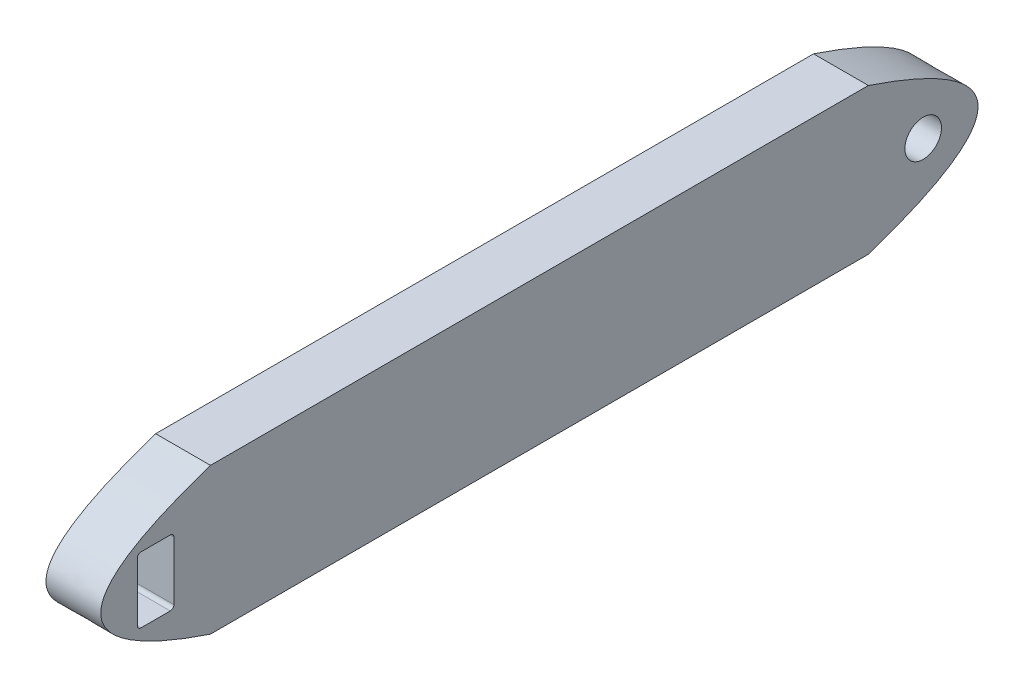
ISO-10303-21;
HEADER;
FILE_DESCRIPTION(('STEP AP214'),'2;1');
FILE_NAME('part.step','',(''),(''),'','','');
FILE_SCHEMA(('AUTOMOTIVE_DESIGN { 1 0 10303 214 1 1 1 1 }'));
ENDSEC;
DATA;
#1=APPLICATION_CONTEXT('core data for automotive mechanical design processes');
#2=APPLICATION_PROTOCOL_DEFINITION('international standard','automotive_design',2000,#1);
#3=PRODUCT_CONTEXT('',#1,'mechanical');
#4=PRODUCT('Part','Part','',(#3));
#5=PRODUCT_RELATED_PRODUCT_CATEGORY('part','',(#4));
#6=PRODUCT_DEFINITION_FORMATION('','',#4);
#7=PRODUCT_DEFINITION_CONTEXT('part definition',#1,'design');
#8=PRODUCT_DEFINITION('design','',#6,#7);
#9=PRODUCT_DEFINITION_SHAPE('','',#8);
#10=(LENGTH_UNIT() NAMED_UNIT(*) SI_UNIT(.MILLI.,.METRE.));
#11=(NAMED_UNIT(*) PLANE_ANGLE_UNIT() SI_UNIT($,.RADIAN.));
#12=(NAMED_UNIT(*) SI_UNIT($,.STERADIAN.) SOLID_ANGLE_UNIT());
#13=UNCERTAINTY_MEASURE_WITH_UNIT(LENGTH_MEASURE(1.E-05),#10,'distance_accuracy_value','');
#14=(GEOMETRIC_REPRESENTATION_CONTEXT(3) GLOBAL_UNCERTAINTY_ASSIGNED_CONTEXT((#13)) GLOBAL_UNIT_ASSIGNED_CONTEXT((#10,
#11,#12)) REPRESENTATION_CONTEXT('',''));
#15=CARTESIAN_POINT('',(0.,0.,0.));
#16=DIRECTION('',(0.,0.,1.));
#17=DIRECTION('',(1.,0.,0.));
#18=AXIS2_PLACEMENT_3D('',#15,#16,#17);
#19=CARTESIAN_POINT('',(15.,1.9853372072383,72.1526989816066));
#20=DIRECTION('',(-1.,0.,0.));
#21=DIRECTION('',(0.,0.,1.));
#22=AXIS2_PLACEMENT_3D('',#19,#20,#21);
#23=PLANE('',#22);
#24=CARTESIAN_POINT('',(15.,21.9853372072383,42.1526989816066));
#25=CARTESIAN_POINT('',(15.,1.9853372072383,102.152698981607));
#26=CARTESIAN_POINT('',(15.,-18.0146627927617,42.1526989816066));
#27=B_SPLINE_CURVE_WITH_KNOTS('',2,(#24,#25,#26),.UNSPECIFIED.,.F.,.F.,(3,3),(0.,1.),.UNSPECIFIED.);
#28=CARTESIAN_POINT('',(15.,21.9853372072383,42.1526989816066));
#29=VERTEX_POINT('',#28);
#30=CARTESIAN_POINT('',(15.,-18.0146627927617,42.1526989816066));
#31=VERTEX_POINT('',#30);
#32=EDGE_CURVE('E245',#29,#31,#27,.T.);
#33=ORIENTED_EDGE('',*,*,#32,.T.);
#34=DIRECTION('',(0.,0.,-1.));
#35=VECTOR('',#34,1.);
#36=CARTESIAN_POINT('',(15.,-18.0146627927617,42.1526989816066));
#37=LINE('',#36,#35);
#38=CARTESIAN_POINT('',(15.,-18.0146627927617,-137.847301018393));
#39=VERTEX_POINT('',#38);
#40=EDGE_CURVE('E95',#31,#39,#37,.T.);
#41=ORIENTED_EDGE('',*,*,#40,.T.);
#42=CARTESIAN_POINT('',(15.,-18.0146627927617,-137.847301018393));
#43=CARTESIAN_POINT('',(15.,1.98533720723832,-197.847301018393));
#44=CARTESIAN_POINT('',(15.,21.9853372072383,-137.847301018393));
#45=B_SPLINE_CURVE_WITH_KNOTS('',2,(#42,#43,#44),.UNSPECIFIED.,.F.,.F.,(3,3),(0.,1.),.UNSPECIFIED.);
#46=CARTESIAN_POINT('',(15.,21.9853372072383,-137.847301018393));
#47=VERTEX_POINT('',#46);
#48=EDGE_CURVE('E256',#39,#47,#45,.T.);
#49=ORIENTED_EDGE('',*,*,#48,.T.);
#50=DIRECTION('',(0.,0.,1.));
#51=VECTOR('',#50,1.);
#52=CARTESIAN_POINT('',(15.,21.9853372072383,42.1526989816066));
#53=LINE('',#52,#51);
#54=EDGE_CURVE('E67',#47,#29,#53,.T.);
#55=ORIENTED_EDGE('',*,*,#54,.T.);
#56=EDGE_LOOP('',(#33,#41,#49,#55));
#57=FACE_BOUND('',#56,.T.);
#58=DIRECTION('',(0.,-1.,0.));
#59=VECTOR('',#58,1.);
#60=CARTESIAN_POINT('',(15.,9.98533720723832,62.1526989816066));
#61=LINE('',#60,#59);
#62=CARTESIAN_POINT('',(15.,9.98533720723832,62.1526989816066));
#63=VERTEX_POINT('',#62);
#64=CARTESIAN_POINT('',(15.,-6.0146627927617,62.1526989816066));
#65=VERTEX_POINT('',#64);
#66=EDGE_CURVE('E194',#63,#65,#61,.T.);
#67=ORIENTED_EDGE('',*,*,#66,.F.);
#68=CARTESIAN_POINT('',(15.,9.9853372072383,61.1526989816066));
#69=DIRECTION('',(1.,0.,0.));
#70=DIRECTION('',(0.,0.,1.));
#71=AXIS2_PLACEMENT_3D('',#68,#69,#70);
#72=CIRCLE('',#71,1.);
#73=CARTESIAN_POINT('',(15.,10.9853372072383,61.1526989816066));
#74=VERTEX_POINT('',#73);
#75=EDGE_CURVE('E58',#74,#63,#72,.T.);
#76=ORIENTED_EDGE('',*,*,#75,.F.);
#77=DIRECTION('',(0.,0.,1.));
#78=VECTOR('',#77,1.);
#79=CARTESIAN_POINT('',(15.,10.9853372072383,53.1526989816066));
#80=LINE('',#79,#78);
#81=CARTESIAN_POINT('',(15.,10.9853372072383,53.1526989816066));
#82=VERTEX_POINT('',#81);
#83=EDGE_CURVE('E166',#82,#74,#80,.T.);
#84=ORIENTED_EDGE('',*,*,#83,.F.);
#85=CARTESIAN_POINT('',(15.,9.9853372072383,53.1526989816066));
#86=DIRECTION('',(1.,0.,0.));
#87=DIRECTION('',(0.,0.,-1.));
#88=AXIS2_PLACEMENT_3D('',#85,#86,#87);
#89=CIRCLE('',#88,1.);
#90=CARTESIAN_POINT('',(15.,9.98533720723832,52.1526989816066));
#91=VERTEX_POINT('',#90);
#92=EDGE_CURVE('E170',#91,#82,#89,.T.);
#93=ORIENTED_EDGE('',*,*,#92,.F.);
#94=DIRECTION('',(0.,1.,0.));
#95=VECTOR('',#94,1.);
#96=CARTESIAN_POINT('',(15.,9.98533720723832,52.1526989816066));
#97=LINE('',#96,#95);
#98=CARTESIAN_POINT('',(15.,-6.0146627927617,52.1526989816066));
#99=VERTEX_POINT('',#98);
#100=EDGE_CURVE('E209',#99,#91,#97,.T.);
#101=ORIENTED_EDGE('',*,*,#100,.F.);
#102=CARTESIAN_POINT('',(15.,-6.01466279276169,53.1526989816066));
#103=DIRECTION('',(1.,0.,0.));
#104=DIRECTION('',(0.,0.,1.));
#105=AXIS2_PLACEMENT_3D('',#102,#103,#104);
#106=CIRCLE('',#105,1.);
#107=CARTESIAN_POINT('',(15.,-7.01466279276169,53.1526989816066));
#108=VERTEX_POINT('',#107);
#109=EDGE_CURVE('E205',#108,#99,#106,.T.);
#110=ORIENTED_EDGE('',*,*,#109,.F.);
#111=DIRECTION('',(0.,0.,-1.));
#112=VECTOR('',#111,1.);
#113=CARTESIAN_POINT('',(15.,-7.01466279276169,53.1526989816066));
#114=LINE('',#113,#112);
#115=CARTESIAN_POINT('',(15.,-7.01466279276169,61.1526989816066));
#116=VERTEX_POINT('',#115);
#117=EDGE_CURVE('E201',#116,#108,#114,.T.);
#118=ORIENTED_EDGE('',*,*,#117,.F.);
#119=CARTESIAN_POINT('',(15.,-6.01466279276169,61.1526989816066));
#120=DIRECTION('',(1.,0.,0.));
#121=DIRECTION('',(0.,0.,-1.));
#122=AXIS2_PLACEMENT_3D('',#119,#120,#121);
#123=CIRCLE('',#122,0.999999999999999);
#124=EDGE_CURVE('E197',#65,#116,#123,.T.);
#125=ORIENTED_EDGE('',*,*,#124,.F.);
#126=EDGE_LOOP('',(#67,#76,#84,#93,#101,#110,#118,#125));
#127=FACE_BOUND('',#126,.T.);
#128=CARTESIAN_POINT('',(15.,1.9853372072383,-152.847301018393));
#129=DIRECTION('',(1.,0.,0.));
#130=DIRECTION('',(0.,0.,-1.));
#131=AXIS2_PLACEMENT_3D('',#128,#129,#130);
#132=CIRCLE('',#131,4.99999999999999);
#133=CARTESIAN_POINT('',(15.,1.9853372072383,-157.847301018393));
#134=VERTEX_POINT('',#133);
#135=EDGE_CURVE('E238',#134,#134,#132,.T.);
#136=ORIENTED_EDGE('',*,*,#135,.F.);
#137=EDGE_LOOP('',(#136));
#138=FACE_BOUND('',#137,.T.);
#139=ADVANCED_FACE('F41',(#57,#127,#138),#23,.F.);
#140=CARTESIAN_POINT('',(0.,1.9853372072383,72.1526989816066));
#141=DIRECTION('',(-1.,0.,0.));
#142=DIRECTION('',(0.,0.,1.));
#143=AXIS2_PLACEMENT_3D('',#140,#141,#142);
#144=PLANE('',#143);
#145=CARTESIAN_POINT('',(0.,9.9853372072383,61.1526989816066));
#146=DIRECTION('',(1.,0.,0.));
#147=DIRECTION('',(0.,0.,1.));
#148=AXIS2_PLACEMENT_3D('',#145,#146,#147);
#149=CIRCLE('',#148,1.);
#150=CARTESIAN_POINT('',(0.,10.9853372072383,61.1526989816066));
#151=VERTEX_POINT('',#150);
#152=CARTESIAN_POINT('',(0.,9.98533720723832,62.1526989816066));
#153=VERTEX_POINT('',#152);
#154=EDGE_CURVE('E153',#151,#153,#149,.T.);
#155=ORIENTED_EDGE('',*,*,#154,.T.);
#156=DIRECTION('',(0.,-1.,0.));
#157=VECTOR('',#156,1.);
#158=CARTESIAN_POINT('',(0.,9.98533720723832,62.1526989816066));
#159=LINE('',#158,#157);
#160=CARTESIAN_POINT('',(0.,-6.0146627927617,62.1526989816066));
#161=VERTEX_POINT('',#160);
#162=EDGE_CURVE('E141',#153,#161,#159,.T.);
#163=ORIENTED_EDGE('',*,*,#162,.T.);
#164=CARTESIAN_POINT('',(0.,-6.01466279276169,61.1526989816066));
#165=DIRECTION('',(1.,0.,0.));
#166=DIRECTION('',(0.,0.,-1.));
#167=AXIS2_PLACEMENT_3D('',#164,#165,#166);
#168=CIRCLE('',#167,0.999999999999999);
#169=CARTESIAN_POINT('',(0.,-7.01466279276169,61.1526989816066));
#170=VERTEX_POINT('',#169);
#171=EDGE_CURVE('E152',#161,#170,#168,.T.);
#172=ORIENTED_EDGE('',*,*,#171,.T.);
#173=DIRECTION('',(0.,0.,-1.));
#174=VECTOR('',#173,1.);
#175=CARTESIAN_POINT('',(0.,-7.01466279276169,53.1526989816066));
#176=LINE('',#175,#174);
#177=CARTESIAN_POINT('',(0.,-7.01466279276169,53.1526989816066));
#178=VERTEX_POINT('',#177);
#179=EDGE_CURVE('E175',#170,#178,#176,.T.);
#180=ORIENTED_EDGE('',*,*,#179,.T.);
#181=CARTESIAN_POINT('',(0.,-6.01466279276169,53.1526989816066));
#182=DIRECTION('',(1.,0.,0.));
#183=DIRECTION('',(0.,0.,1.));
#184=AXIS2_PLACEMENT_3D('',#181,#182,#183);
#185=CIRCLE('',#184,1.);
#186=CARTESIAN_POINT('',(0.,-6.0146627927617,52.1526989816066));
#187=VERTEX_POINT('',#186);
#188=EDGE_CURVE('E179',#178,#187,#185,.T.);
#189=ORIENTED_EDGE('',*,*,#188,.T.);
#190=DIRECTION('',(0.,1.,0.));
#191=VECTOR('',#190,1.);
#192=CARTESIAN_POINT('',(0.,9.98533720723832,52.1526989816066));
#193=LINE('',#192,#191);
#194=CARTESIAN_POINT('',(0.,9.98533720723832,52.1526989816066));
#195=VERTEX_POINT('',#194);
#196=EDGE_CURVE('E183',#187,#195,#193,.T.);
#197=ORIENTED_EDGE('',*,*,#196,.T.);
#198=CARTESIAN_POINT('',(0.,9.9853372072383,53.1526989816066));
#199=DIRECTION('',(1.,0.,0.));
#200=DIRECTION('',(0.,0.,-1.));
#201=AXIS2_PLACEMENT_3D('',#198,#199,#200);
#202=CIRCLE('',#201,1.);
#203=CARTESIAN_POINT('',(0.,10.9853372072383,53.1526989816066));
#204=VERTEX_POINT('',#203);
#205=EDGE_CURVE('E187',#195,#204,#202,.T.);
#206=ORIENTED_EDGE('',*,*,#205,.T.);
#207=DIRECTION('',(0.,0.,1.));
#208=VECTOR('',#207,1.);
#209=CARTESIAN_POINT('',(0.,10.9853372072383,53.1526989816066));
#210=LINE('',#209,#208);
#211=EDGE_CURVE('E159',#204,#151,#210,.T.);
#212=ORIENTED_EDGE('',*,*,#211,.T.);
#213=EDGE_LOOP('',(#155,#163,#172,#180,#189,#197,#206,#212));
#214=FACE_BOUND('',#213,.T.);
#215=CARTESIAN_POINT('',(0.,21.9853372072383,42.1526989816066));
#216=CARTESIAN_POINT('',(0.,1.9853372072383,102.152698981607));
#217=CARTESIAN_POINT('',(0.,-18.0146627927617,42.1526989816066));
#218=B_SPLINE_CURVE_WITH_KNOTS('',2,(#215,#216,#217),.UNSPECIFIED.,.F.,.F.,(3,3),(0.,1.),.UNSPECIFIED.);
#219=CARTESIAN_POINT('',(0.,21.9853372072383,42.1526989816066));
#220=VERTEX_POINT('',#219);
#221=CARTESIAN_POINT('',(0.,-18.0146627927617,42.1526989816066));
#222=VERTEX_POINT('',#221);
#223=EDGE_CURVE('E242',#220,#222,#218,.T.);
#224=ORIENTED_EDGE('',*,*,#223,.F.);
#225=DIRECTION('',(0.,0.,1.));
#226=VECTOR('',#225,1.);
#227=CARTESIAN_POINT('',(0.,21.9853372072383,42.1526989816066));
#228=LINE('',#227,#226);
#229=CARTESIAN_POINT('',(0.,21.9853372072383,-137.847301018393));
#230=VERTEX_POINT('',#229);
#231=EDGE_CURVE('E88',#230,#220,#228,.T.);
#232=ORIENTED_EDGE('',*,*,#231,.F.);
#233=CARTESIAN_POINT('',(0.,-18.0146627927617,-137.847301018393));
#234=CARTESIAN_POINT('',(0.,1.98533720723832,-197.847301018393));
#235=CARTESIAN_POINT('',(0.,21.9853372072383,-137.847301018393));
#236=B_SPLINE_CURVE_WITH_KNOTS('',2,(#233,#234,#235),.UNSPECIFIED.,.F.,.F.,(3,3),(0.,1.),.UNSPECIFIED.);
#237=CARTESIAN_POINT('',(0.,-18.0146627927617,-137.847301018393));
#238=VERTEX_POINT('',#237);
#239=EDGE_CURVE('E429',#238,#230,#236,.T.);
#240=ORIENTED_EDGE('',*,*,#239,.F.);
#241=DIRECTION('',(0.,0.,-1.));
#242=VECTOR('',#241,1.);
#243=CARTESIAN_POINT('',(0.,-18.0146627927617,42.1526989816066));
#244=LINE('',#243,#242);
#245=EDGE_CURVE('E424',#222,#238,#244,.T.);
#246=ORIENTED_EDGE('',*,*,#245,.F.);
#247=EDGE_LOOP('',(#224,#232,#240,#246));
#248=FACE_BOUND('',#247,.T.);
#249=CARTESIAN_POINT('',(0.,1.9853372072383,-152.847301018393));
#250=DIRECTION('',(1.,0.,0.));
#251=DIRECTION('',(0.,0.,-1.));
#252=AXIS2_PLACEMENT_3D('',#249,#250,#251);
#253=CIRCLE('',#252,4.99999999999999);
#254=CARTESIAN_POINT('',(0.,1.9853372072383,-157.847301018393));
#255=VERTEX_POINT('',#254);
#256=EDGE_CURVE('E218',#255,#255,#253,.T.);
#257=ORIENTED_EDGE('',*,*,#256,.T.);
#258=EDGE_LOOP('',(#257));
#259=FACE_BOUND('',#258,.T.);
#260=ADVANCED_FACE('F161',(#214,#248,#259),#144,.T.);
#261=DIRECTION('',(-1.,0.,0.));
#262=VECTOR('',#261,1.);
#263=SURFACE_OF_LINEAR_EXTRUSION('',#27,#262);
#264=ORIENTED_EDGE('',*,*,#223,.T.);
#265=DIRECTION('',(-1.,0.,0.));
#266=VECTOR('',#265,1.);
#267=CARTESIAN_POINT('',(15.,-18.0146627927617,42.1526989816066));
#268=LINE('',#267,#266);
#269=EDGE_CURVE('E11',#31,#222,#268,.T.);
#270=ORIENTED_EDGE('',*,*,#269,.F.);
#271=ORIENTED_EDGE('',*,*,#32,.F.);
#272=DIRECTION('',(-1.,0.,0.));
#273=VECTOR('',#272,1.);
#274=CARTESIAN_POINT('',(15.,21.9853372072383,42.1526989816066));
#275=LINE('',#274,#273);
#276=EDGE_CURVE('E444',#29,#220,#275,.T.);
#277=ORIENTED_EDGE('',*,*,#276,.T.);
#278=EDGE_LOOP('',(#264,#270,#271,#277));
#279=FACE_BOUND('',#278,.T.);
#280=ADVANCED_FACE('F43',(#279),#263,.F.);
#281=CARTESIAN_POINT('',(15.,-18.0146627927617,42.1526989816066));
#282=DIRECTION('',(0.,1.,0.));
#283=DIRECTION('',(0.,0.,1.));
#284=AXIS2_PLACEMENT_3D('',#281,#282,#283);
#285=PLANE('',#284);
#286=ORIENTED_EDGE('',*,*,#245,.T.);
#287=DIRECTION('',(-1.,0.,0.));
#288=VECTOR('',#287,1.);
#289=CARTESIAN_POINT('',(15.,-18.0146627927617,-137.847301018393));
#290=LINE('',#289,#288);
#291=EDGE_CURVE('E51',#39,#238,#290,.T.);
#292=ORIENTED_EDGE('',*,*,#291,.F.);
#293=ORIENTED_EDGE('',*,*,#40,.F.);
#294=ORIENTED_EDGE('',*,*,#269,.T.);
#295=EDGE_LOOP('',(#286,#292,#293,#294));
#296=FACE_BOUND('',#295,.T.);
#297=ADVANCED_FACE('F271',(#296),#285,.F.);
#298=DIRECTION('',(-1.,0.,0.));
#299=VECTOR('',#298,1.);
#300=SURFACE_OF_LINEAR_EXTRUSION('',#45,#299);
#301=ORIENTED_EDGE('',*,*,#239,.T.);
#302=DIRECTION('',(-1.,0.,0.));
#303=VECTOR('',#302,1.);
#304=CARTESIAN_POINT('',(15.,21.9853372072383,-137.847301018393));
#305=LINE('',#304,#303);
#306=EDGE_CURVE('E433',#47,#230,#305,.T.);
#307=ORIENTED_EDGE('',*,*,#306,.F.);
#308=ORIENTED_EDGE('',*,*,#48,.F.);
#309=ORIENTED_EDGE('',*,*,#291,.T.);
#310=EDGE_LOOP('',(#301,#307,#308,#309));
#311=FACE_BOUND('',#310,.T.);
#312=ADVANCED_FACE('F267',(#311),#300,.F.);
#313=CARTESIAN_POINT('',(15.,21.9853372072383,42.1526989816066));
#314=DIRECTION('',(0.,-1.,0.));
#315=DIRECTION('',(0.,0.,-1.));
#316=AXIS2_PLACEMENT_3D('',#313,#314,#315);
#317=PLANE('',#316);
#318=ORIENTED_EDGE('',*,*,#231,.T.);
#319=ORIENTED_EDGE('',*,*,#276,.F.);
#320=ORIENTED_EDGE('',*,*,#54,.F.);
#321=ORIENTED_EDGE('',*,*,#306,.T.);
#322=EDGE_LOOP('',(#318,#319,#320,#321));
#323=FACE_BOUND('',#322,.T.);
#324=ADVANCED_FACE('F270',(#323),#317,.F.);
#325=CARTESIAN_POINT('',(15.,1.9853372072383,-152.847301018393));
#326=DIRECTION('',(-1.,0.,0.));
#327=DIRECTION('',(0.,0.,1.));
#328=AXIS2_PLACEMENT_3D('',#325,#326,#327);
#329=CYLINDRICAL_SURFACE('',#328,4.99999999999999);
#330=ORIENTED_EDGE('',*,*,#135,.T.);
#331=EDGE_LOOP('',(#330));
#332=FACE_BOUND('',#331,.T.);
#333=ORIENTED_EDGE('',*,*,#256,.F.);
#334=EDGE_LOOP('',(#333));
#335=FACE_BOUND('',#334,.T.);
#336=ADVANCED_FACE('F286',(#332,#335),#329,.F.);
#337=CARTESIAN_POINT('',(0.,9.98533720723832,52.1526989816066));
#338=DIRECTION('',(0.,0.,-1.));
#339=DIRECTION('',(-1.,0.,0.));
#340=AXIS2_PLACEMENT_3D('',#337,#338,#339);
#341=PLANE('',#340);
#342=ORIENTED_EDGE('',*,*,#100,.T.);
#343=DIRECTION('',(1.,0.,0.));
#344=VECTOR('',#343,1.);
#345=CARTESIAN_POINT('',(0.,9.98533720723832,52.1526989816066));
#346=LINE('',#345,#344);
#347=EDGE_CURVE('E222',#195,#91,#346,.T.);
#348=ORIENTED_EDGE('',*,*,#347,.F.);
#349=ORIENTED_EDGE('',*,*,#196,.F.);
#350=DIRECTION('',(1.,0.,0.));
#351=VECTOR('',#350,1.);
#352=CARTESIAN_POINT('',(0.,-6.0146627927617,52.1526989816066));
#353=LINE('',#352,#351);
#354=EDGE_CURVE('E226',#187,#99,#353,.T.);
#355=ORIENTED_EDGE('',*,*,#354,.T.);
#356=EDGE_LOOP('',(#342,#348,#349,#355));
#357=FACE_BOUND('',#356,.T.);
#358=ADVANCED_FACE('F289',(#357),#341,.F.);
#359=CARTESIAN_POINT('',(0.,9.98533720723832,62.1526989816066));
#360=DIRECTION('',(0.,0.,1.));
#361=DIRECTION('',(0.,-1.,0.));
#362=AXIS2_PLACEMENT_3D('',#359,#360,#361);
#363=PLANE('',#362);
#364=ORIENTED_EDGE('',*,*,#66,.T.);
#365=DIRECTION('',(1.,0.,0.));
#366=VECTOR('',#365,1.);
#367=CARTESIAN_POINT('',(0.,-6.0146627927617,62.1526989816066));
#368=LINE('',#367,#366);
#369=EDGE_CURVE('E146',#161,#65,#368,.T.);
#370=ORIENTED_EDGE('',*,*,#369,.F.);
#371=ORIENTED_EDGE('',*,*,#162,.F.);
#372=DIRECTION('',(1.,0.,0.));
#373=VECTOR('',#372,1.);
#374=CARTESIAN_POINT('',(0.,9.98533720723832,62.1526989816066));
#375=LINE('',#374,#373);
#376=EDGE_CURVE('E143',#153,#63,#375,.T.);
#377=ORIENTED_EDGE('',*,*,#376,.T.);
#378=EDGE_LOOP('',(#364,#370,#371,#377));
#379=FACE_BOUND('',#378,.T.);
#380=ADVANCED_FACE('F142',(#379),#363,.F.);
#381=CARTESIAN_POINT('',(0.,9.9853372072383,61.1526989816066));
#382=DIRECTION('',(1.,0.,0.));
#383=DIRECTION('',(0.,0.,-1.));
#384=AXIS2_PLACEMENT_3D('',#381,#382,#383);
#385=CYLINDRICAL_SURFACE('',#384,1.);
#386=ORIENTED_EDGE('',*,*,#75,.T.);
#387=ORIENTED_EDGE('',*,*,#376,.F.);
#388=ORIENTED_EDGE('',*,*,#154,.F.);
#389=DIRECTION('',(1.,0.,0.));
#390=VECTOR('',#389,1.);
#391=CARTESIAN_POINT('',(0.,10.9853372072383,61.1526989816066));
#392=LINE('',#391,#390);
#393=EDGE_CURVE('E215',#151,#74,#392,.T.);
#394=ORIENTED_EDGE('',*,*,#393,.T.);
#395=EDGE_LOOP('',(#386,#387,#388,#394));
#396=FACE_BOUND('',#395,.T.);
#397=ADVANCED_FACE('F156',(#396),#385,.F.);
#398=CARTESIAN_POINT('',(0.,10.9853372072383,53.1526989816066));
#399=DIRECTION('',(0.,1.,0.));
#400=DIRECTION('',(0.,0.,1.));
#401=AXIS2_PLACEMENT_3D('',#398,#399,#400);
#402=PLANE('',#401);
#403=ORIENTED_EDGE('',*,*,#83,.T.);
#404=ORIENTED_EDGE('',*,*,#393,.F.);
#405=ORIENTED_EDGE('',*,*,#211,.F.);
#406=DIRECTION('',(1.,0.,0.));
#407=VECTOR('',#406,1.);
#408=CARTESIAN_POINT('',(0.,10.9853372072383,53.1526989816066));
#409=LINE('',#408,#407);
#410=EDGE_CURVE('E219',#204,#82,#409,.T.);
#411=ORIENTED_EDGE('',*,*,#410,.T.);
#412=EDGE_LOOP('',(#403,#404,#405,#411));
#413=FACE_BOUND('',#412,.T.);
#414=ADVANCED_FACE('F293',(#413),#402,.F.);
#415=CARTESIAN_POINT('',(0.,9.9853372072383,53.1526989816066));
#416=DIRECTION('',(1.,0.,0.));
#417=DIRECTION('',(0.,0.,-1.));
#418=AXIS2_PLACEMENT_3D('',#415,#416,#417);
#419=CYLINDRICAL_SURFACE('',#418,1.);
#420=ORIENTED_EDGE('',*,*,#92,.T.);
#421=ORIENTED_EDGE('',*,*,#410,.F.);
#422=ORIENTED_EDGE('',*,*,#205,.F.);
#423=ORIENTED_EDGE('',*,*,#347,.T.);
#424=EDGE_LOOP('',(#420,#421,#422,#423));
#425=FACE_BOUND('',#424,.T.);
#426=ADVANCED_FACE('F307',(#425),#419,.F.);
#427=CARTESIAN_POINT('',(0.,-6.01466279276169,53.1526989816066));
#428=DIRECTION('',(1.,0.,0.));
#429=DIRECTION('',(0.,0.,-1.));
#430=AXIS2_PLACEMENT_3D('',#427,#428,#429);
#431=CYLINDRICAL_SURFACE('',#430,1.);
#432=ORIENTED_EDGE('',*,*,#109,.T.);
#433=ORIENTED_EDGE('',*,*,#354,.F.);
#434=ORIENTED_EDGE('',*,*,#188,.F.);
#435=DIRECTION('',(1.,0.,0.));
#436=VECTOR('',#435,1.);
#437=CARTESIAN_POINT('',(0.,-7.01466279276169,53.1526989816066));
#438=LINE('',#437,#436);
#439=EDGE_CURVE('E230',#178,#108,#438,.T.);
#440=ORIENTED_EDGE('',*,*,#439,.T.);
#441=EDGE_LOOP('',(#432,#433,#434,#440));
#442=FACE_BOUND('',#441,.T.);
#443=ADVANCED_FACE('F303',(#442),#431,.F.);
#444=CARTESIAN_POINT('',(0.,-7.01466279276169,53.1526989816066));
#445=DIRECTION('',(0.,-1.,0.));
#446=DIRECTION('',(0.,0.,-1.));
#447=AXIS2_PLACEMENT_3D('',#444,#445,#446);
#448=PLANE('',#447);
#449=ORIENTED_EDGE('',*,*,#117,.T.);
#450=ORIENTED_EDGE('',*,*,#439,.F.);
#451=ORIENTED_EDGE('',*,*,#179,.F.);
#452=DIRECTION('',(1.,0.,0.));
#453=VECTOR('',#452,1.);
#454=CARTESIAN_POINT('',(0.,-7.01466279276169,61.1526989816066));
#455=LINE('',#454,#453);
#456=EDGE_CURVE('E233',#170,#116,#455,.T.);
#457=ORIENTED_EDGE('',*,*,#456,.T.);
#458=EDGE_LOOP('',(#449,#450,#451,#457));
#459=FACE_BOUND('',#458,.T.);
#460=ADVANCED_FACE('F299',(#459),#448,.F.);
#461=CARTESIAN_POINT('',(0.,-6.01466279276169,61.1526989816066));
#462=DIRECTION('',(1.,0.,0.));
#463=DIRECTION('',(0.,0.,-1.));
#464=AXIS2_PLACEMENT_3D('',#461,#462,#463);
#465=CYLINDRICAL_SURFACE('',#464,0.999999999999999);
#466=ORIENTED_EDGE('',*,*,#124,.T.);
#467=ORIENTED_EDGE('',*,*,#456,.F.);
#468=ORIENTED_EDGE('',*,*,#171,.F.);
#469=ORIENTED_EDGE('',*,*,#369,.T.);
#470=EDGE_LOOP('',(#466,#467,#468,#469));
#471=FACE_BOUND('',#470,.T.);
#472=ADVANCED_FACE('F296',(#471),#465,.F.);
#473=CLOSED_SHELL('',(#139,#260,#280,#297,#312,#324,#336,#358,#380,#397,#414,#426,#443,#460,#472));
#474=MANIFOLD_SOLID_BREP('B2',#473);
#475=ADVANCED_BREP_SHAPE_REPRESENTATION('',(#18,#474),#14);
#476=SHAPE_DEFINITION_REPRESENTATION(#9,#475);
ENDSEC;
END-ISO-10303-21;
